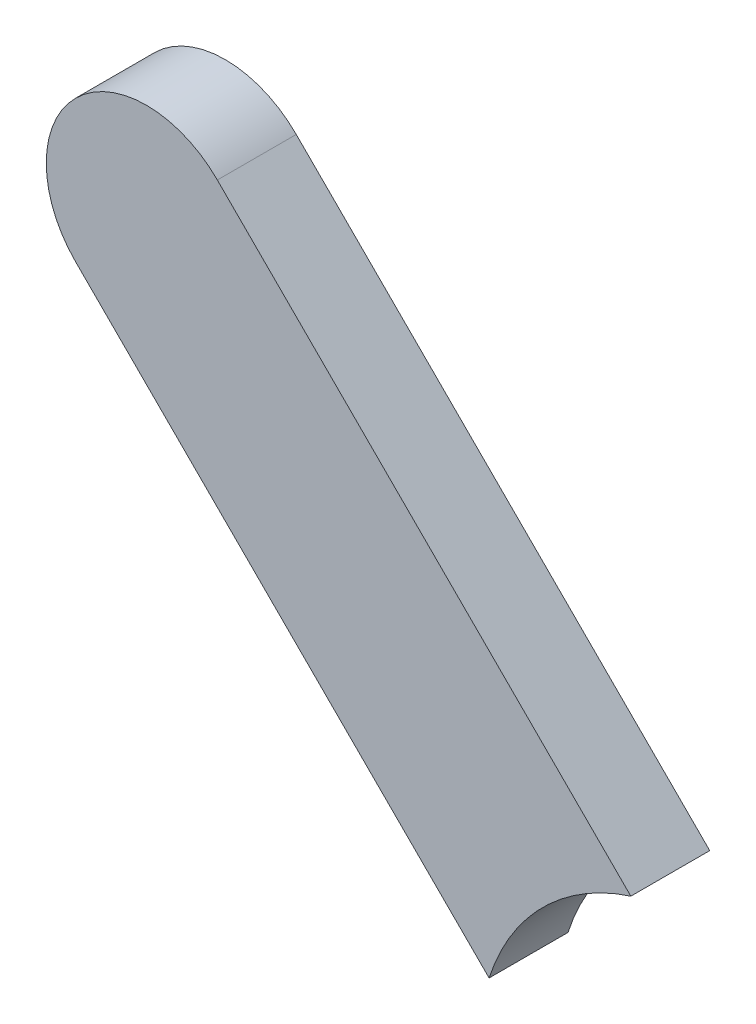
ISO-10303-21;
HEADER;
FILE_DESCRIPTION(('STEP AP214'),'2;1');
FILE_NAME('part.step','',(''),(''),'','','');
FILE_SCHEMA(('AUTOMOTIVE_DESIGN { 1 0 10303 214 1 1 1 1 }'));
ENDSEC;
DATA;
#1=APPLICATION_CONTEXT('core data for automotive mechanical design processes');
#2=APPLICATION_PROTOCOL_DEFINITION('international standard','automotive_design',2000,#1);
#3=PRODUCT_CONTEXT('',#1,'mechanical');
#4=PRODUCT('Part','Part','',(#3));
#5=PRODUCT_RELATED_PRODUCT_CATEGORY('part','',(#4));
#6=PRODUCT_DEFINITION_FORMATION('','',#4);
#7=PRODUCT_DEFINITION_CONTEXT('part definition',#1,'design');
#8=PRODUCT_DEFINITION('design','',#6,#7);
#9=PRODUCT_DEFINITION_SHAPE('','',#8);
#10=(LENGTH_UNIT() NAMED_UNIT(*) SI_UNIT(.MILLI.,.METRE.));
#11=(NAMED_UNIT(*) PLANE_ANGLE_UNIT() SI_UNIT($,.RADIAN.));
#12=(NAMED_UNIT(*) SI_UNIT($,.STERADIAN.) SOLID_ANGLE_UNIT());
#13=UNCERTAINTY_MEASURE_WITH_UNIT(LENGTH_MEASURE(1.E-05),#10,'distance_accuracy_value','');
#14=(GEOMETRIC_REPRESENTATION_CONTEXT(3) GLOBAL_UNCERTAINTY_ASSIGNED_CONTEXT((#13)) GLOBAL_UNIT_ASSIGNED_CONTEXT((#10,
#11,#12)) REPRESENTATION_CONTEXT('',''));
#15=CARTESIAN_POINT('',(0.,0.,0.));
#16=DIRECTION('',(0.,0.,1.));
#17=DIRECTION('',(1.,0.,0.));
#18=AXIS2_PLACEMENT_3D('',#15,#16,#17);
#19=CARTESIAN_POINT('',(147.39439406,107.3863994,0.));
#20=DIRECTION('',(0.70710678118654,0.707106781186555,0.));
#21=DIRECTION('',(0.707106781186555,-0.70710678118654,0.));
#22=AXIS2_PLACEMENT_3D('',#19,#20,#21);
#23=PLANE('',#22);
#24=DIRECTION('',(0.707106781186555,-0.70710678118654,0.));
#25=VECTOR('',#24,1.);
#26=CARTESIAN_POINT('',(147.39439406,107.3863994,0.1999996));
#27=LINE('',#26,#25);
#28=CARTESIAN_POINT('',(147.39439406,107.3863994,0.1999996));
#29=VERTEX_POINT('',#28);
#30=CARTESIAN_POINT('',(148.442461595153,106.338331864847,0.1999996));
#31=VERTEX_POINT('',#30);
#32=EDGE_CURVE('E11',#29,#31,#27,.T.);
#33=ORIENTED_EDGE('',*,*,#32,.F.);
#34=DIRECTION('',(0.,0.,1.));
#35=VECTOR('',#34,1.);
#36=CARTESIAN_POINT('',(147.39439406,107.3863994,0.));
#37=LINE('',#36,#35);
#38=CARTESIAN_POINT('',(147.39439406,107.3863994,0.));
#39=VERTEX_POINT('',#38);
#40=EDGE_CURVE('E24',#39,#29,#37,.T.);
#41=ORIENTED_EDGE('',*,*,#40,.F.);
#42=DIRECTION('',(0.707106781186555,-0.70710678118654,0.));
#43=VECTOR('',#42,1.);
#44=CARTESIAN_POINT('',(147.39439406,107.3863994,0.));
#45=LINE('',#44,#43);
#46=CARTESIAN_POINT('',(148.442461595153,106.338331864847,0.));
#47=VERTEX_POINT('',#46);
#48=EDGE_CURVE('E75',#39,#47,#45,.T.);
#49=ORIENTED_EDGE('',*,*,#48,.T.);
#50=DIRECTION('',(0.,0.,1.));
#51=VECTOR('',#50,1.);
#52=CARTESIAN_POINT('',(148.442461595153,106.338331864847,0.));
#53=LINE('',#52,#51);
#54=EDGE_CURVE('E37',#47,#31,#53,.T.);
#55=ORIENTED_EDGE('',*,*,#54,.T.);
#56=EDGE_LOOP('',(#33,#41,#49,#55));
#57=FACE_BOUND('',#56,.T.);
#58=ADVANCED_FACE('F17',(#57),#23,.F.);
#59=CARTESIAN_POINT('',(148.971,106.1690028,0.));
#60=DIRECTION('',(0.,0.,-1.));
#61=DIRECTION('',(1.,0.,0.));
#62=AXIS2_PLACEMENT_3D('',#59,#60,#61);
#63=CYLINDRICAL_SURFACE('',#62,0.55500016);
#64=DIRECTION('',(0.,0.,1.));
#65=VECTOR('',#64,1.);
#66=CARTESIAN_POINT('',(148.801670935153,106.697541204847,0.));
#67=LINE('',#66,#65);
#68=CARTESIAN_POINT('',(148.801670935153,106.697541204847,0.));
#69=VERTEX_POINT('',#68);
#70=CARTESIAN_POINT('',(148.801670935153,106.697541204847,0.1999996));
#71=VERTEX_POINT('',#70);
#72=EDGE_CURVE('E67',#69,#71,#67,.T.);
#73=ORIENTED_EDGE('',*,*,#72,.T.);
#74=CARTESIAN_POINT('',(148.971,106.1690028,0.1999996));
#75=DIRECTION('',(0.,0.,1.));
#76=DIRECTION('',(1.,0.,0.));
#77=AXIS2_PLACEMENT_3D('',#74,#75,#76);
#78=CIRCLE('',#77,0.55500016);
#79=EDGE_CURVE('E82',#71,#31,#78,.T.);
#80=ORIENTED_EDGE('',*,*,#79,.T.);
#81=ORIENTED_EDGE('',*,*,#54,.F.);
#82=CARTESIAN_POINT('',(148.971,106.1690028,0.));
#83=DIRECTION('',(0.,0.,1.));
#84=DIRECTION('',(1.,0.,0.));
#85=AXIS2_PLACEMENT_3D('',#82,#83,#84);
#86=CIRCLE('',#85,0.55500016);
#87=EDGE_CURVE('E80',#69,#47,#86,.T.);
#88=ORIENTED_EDGE('',*,*,#87,.F.);
#89=EDGE_LOOP('',(#73,#80,#81,#88));
#90=FACE_BOUND('',#89,.T.);
#91=ADVANCED_FACE('F88',(#90),#63,.F.);
#92=CARTESIAN_POINT('',(148.801670935153,106.697541204847,0.));
#93=DIRECTION('',(-0.707106781186548,-0.707106781186548,0.));
#94=DIRECTION('',(-0.707106781186548,0.707106781186548,0.));
#95=AXIS2_PLACEMENT_3D('',#92,#93,#94);
#96=PLANE('',#95);
#97=DIRECTION('',(-0.707106781186548,0.707106781186548,0.));
#98=VECTOR('',#97,1.);
#99=CARTESIAN_POINT('',(149.15060594,106.3486062,0.1999996));
#100=LINE('',#99,#98);
#101=CARTESIAN_POINT('',(147.7536034,107.74560874,0.1999996));
#102=VERTEX_POINT('',#101);
#103=EDGE_CURVE('E71',#71,#102,#100,.T.);
#104=ORIENTED_EDGE('',*,*,#103,.F.);
#105=ORIENTED_EDGE('',*,*,#72,.F.);
#106=DIRECTION('',(-0.707106781186548,0.707106781186548,0.));
#107=VECTOR('',#106,1.);
#108=CARTESIAN_POINT('',(149.15060594,106.3486062,0.));
#109=LINE('',#108,#107);
#110=CARTESIAN_POINT('',(147.7536034,107.74560874,0.));
#111=VERTEX_POINT('',#110);
#112=EDGE_CURVE('E63',#69,#111,#109,.T.);
#113=ORIENTED_EDGE('',*,*,#112,.T.);
#114=DIRECTION('',(0.,0.,1.));
#115=VECTOR('',#114,1.);
#116=CARTESIAN_POINT('',(147.7536034,107.74560874,0.));
#117=LINE('',#116,#115);
#118=EDGE_CURVE('E53',#111,#102,#117,.T.);
#119=ORIENTED_EDGE('',*,*,#118,.T.);
#120=EDGE_LOOP('',(#104,#105,#113,#119));
#121=FACE_BOUND('',#120,.T.);
#122=ADVANCED_FACE('F66',(#121),#96,.F.);
#123=CARTESIAN_POINT('',(147.57399873,107.56600407,0.));
#124=DIRECTION('',(0.,0.,-1.));
#125=DIRECTION('',(0.707106781186576,0.70710678118652,0.));
#126=AXIS2_PLACEMENT_3D('',#123,#124,#125);
#127=CYLINDRICAL_SURFACE('',#126,0.253999360179542);
#128=CARTESIAN_POINT('',(147.57399873,107.56600407,0.1999996));
#129=DIRECTION('',(0.,0.,1.));
#130=DIRECTION('',(0.707106781186576,0.70710678118652,0.));
#131=AXIS2_PLACEMENT_3D('',#128,#129,#130);
#132=CIRCLE('',#131,0.253999360179542);
#133=EDGE_CURVE('E59',#102,#29,#132,.T.);
#134=ORIENTED_EDGE('',*,*,#133,.F.);
#135=ORIENTED_EDGE('',*,*,#118,.F.);
#136=CARTESIAN_POINT('',(147.57399873,107.56600407,0.));
#137=DIRECTION('',(0.,0.,1.));
#138=DIRECTION('',(0.707106781186576,0.70710678118652,0.));
#139=AXIS2_PLACEMENT_3D('',#136,#137,#138);
#140=CIRCLE('',#139,0.253999360179542);
#141=EDGE_CURVE('E57',#111,#39,#140,.T.);
#142=ORIENTED_EDGE('',*,*,#141,.T.);
#143=ORIENTED_EDGE('',*,*,#40,.T.);
#144=EDGE_LOOP('',(#134,#135,#142,#143));
#145=FACE_BOUND('',#144,.T.);
#146=ADVANCED_FACE('F55',(#145),#127,.T.);
#147=CARTESIAN_POINT('',(147.39439406,107.3863994,0.));
#148=DIRECTION('',(0.,0.,-1.));
#149=DIRECTION('',(-1.,0.,0.));
#150=AXIS2_PLACEMENT_3D('',#147,#148,#149);
#151=PLANE('',#150);
#152=ORIENTED_EDGE('',*,*,#48,.F.);
#153=ORIENTED_EDGE('',*,*,#141,.F.);
#154=ORIENTED_EDGE('',*,*,#112,.F.);
#155=ORIENTED_EDGE('',*,*,#87,.T.);
#156=EDGE_LOOP('',(#152,#153,#154,#155));
#157=FACE_BOUND('',#156,.T.);
#158=ADVANCED_FACE('F74',(#157),#151,.T.);
#159=CARTESIAN_POINT('',(147.39439406,107.3863994,0.1999996));
#160=DIRECTION('',(0.,0.,-1.));
#161=DIRECTION('',(-1.,0.,0.));
#162=AXIS2_PLACEMENT_3D('',#159,#160,#161);
#163=PLANE('',#162);
#164=ORIENTED_EDGE('',*,*,#133,.T.);
#165=ORIENTED_EDGE('',*,*,#32,.T.);
#166=ORIENTED_EDGE('',*,*,#79,.F.);
#167=ORIENTED_EDGE('',*,*,#103,.T.);
#168=EDGE_LOOP('',(#164,#165,#166,#167));
#169=FACE_BOUND('',#168,.T.);
#170=ADVANCED_FACE('F91',(#169),#163,.F.);
#171=CLOSED_SHELL('',(#58,#91,#122,#146,#158,#170));
#172=MANIFOLD_SOLID_BREP('B1',#171);
#173=ADVANCED_BREP_SHAPE_REPRESENTATION('',(#18,#172),#14);
#174=SHAPE_DEFINITION_REPRESENTATION(#9,#173);
ENDSEC;
END-ISO-10303-21;
